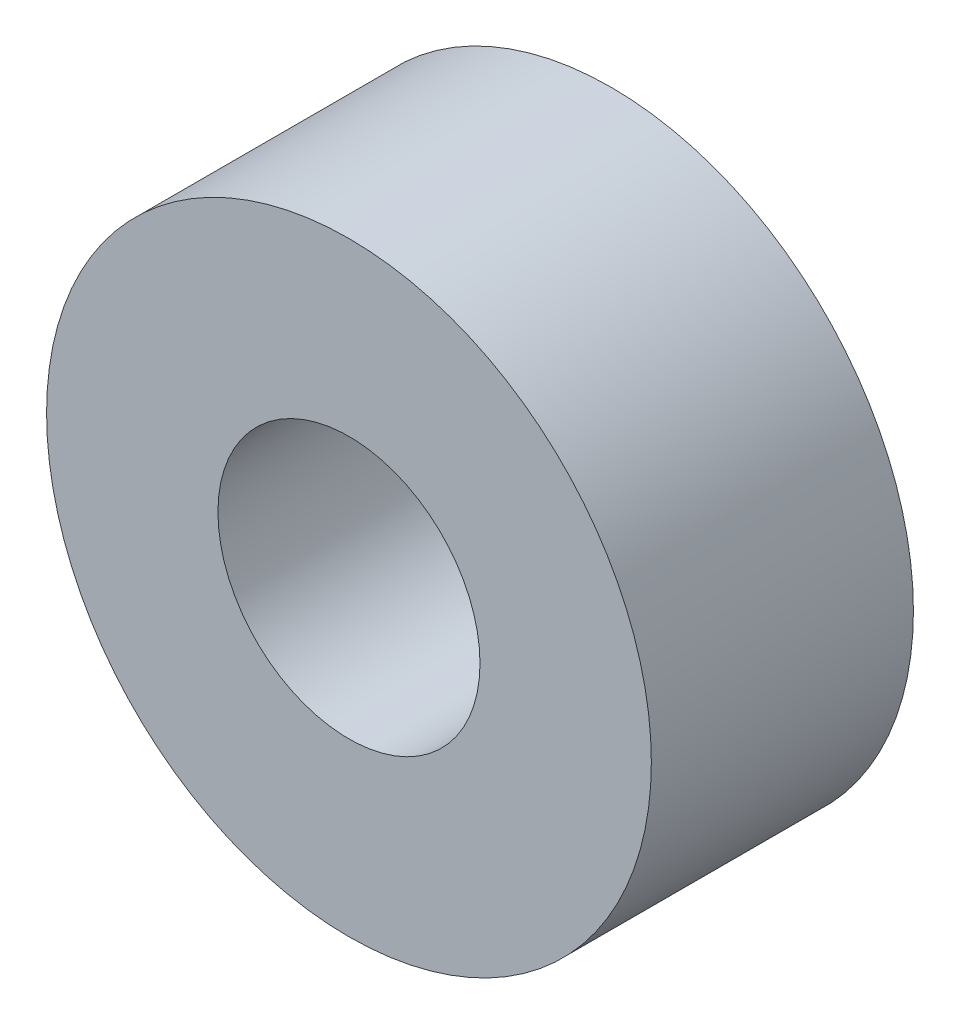
ISO-10303-21;
HEADER;
FILE_DESCRIPTION(('STEP AP214'),'2;1');
FILE_NAME('part.step','',(''),(''),'','','');
FILE_SCHEMA(('AUTOMOTIVE_DESIGN { 1 0 10303 214 1 1 1 1 }'));
ENDSEC;
DATA;
#1=APPLICATION_CONTEXT('core data for automotive mechanical design processes');
#2=APPLICATION_PROTOCOL_DEFINITION('international standard','automotive_design',2000,#1);
#3=PRODUCT_CONTEXT('',#1,'mechanical');
#4=PRODUCT('Part','Part','',(#3));
#5=PRODUCT_RELATED_PRODUCT_CATEGORY('part','',(#4));
#6=PRODUCT_DEFINITION_FORMATION('','',#4);
#7=PRODUCT_DEFINITION_CONTEXT('part definition',#1,'design');
#8=PRODUCT_DEFINITION('design','',#6,#7);
#9=PRODUCT_DEFINITION_SHAPE('','',#8);
#10=(LENGTH_UNIT() NAMED_UNIT(*) SI_UNIT(.MILLI.,.METRE.));
#11=(NAMED_UNIT(*) PLANE_ANGLE_UNIT() SI_UNIT($,.RADIAN.));
#12=(NAMED_UNIT(*) SI_UNIT($,.STERADIAN.) SOLID_ANGLE_UNIT());
#13=UNCERTAINTY_MEASURE_WITH_UNIT(LENGTH_MEASURE(1.E-05),#10,'distance_accuracy_value','');
#14=(GEOMETRIC_REPRESENTATION_CONTEXT(3) GLOBAL_UNCERTAINTY_ASSIGNED_CONTEXT((#13)) GLOBAL_UNIT_ASSIGNED_CONTEXT((#10,
#11,#12)) REPRESENTATION_CONTEXT('',''));
#15=CARTESIAN_POINT('',(0.,0.,0.));
#16=DIRECTION('',(0.,0.,1.));
#17=DIRECTION('',(1.,0.,0.));
#18=AXIS2_PLACEMENT_3D('',#15,#16,#17);
#19=CARTESIAN_POINT('',(0.,0.,6.5));
#20=DIRECTION('',(0.,0.,-1.));
#21=DIRECTION('',(-1.,0.,0.));
#22=AXIS2_PLACEMENT_3D('',#19,#20,#21);
#23=CYLINDRICAL_SURFACE('',#22,7.5);
#24=CARTESIAN_POINT('',(0.,0.,6.5));
#25=DIRECTION('',(0.,0.,1.));
#26=DIRECTION('',(1.,0.,0.));
#27=AXIS2_PLACEMENT_3D('',#24,#25,#26);
#28=CIRCLE('',#27,7.5);
#29=CARTESIAN_POINT('',(7.5,0.,6.5));
#30=VERTEX_POINT('',#29);
#31=EDGE_CURVE('E10',#30,#30,#28,.T.);
#32=ORIENTED_EDGE('',*,*,#31,.F.);
#33=EDGE_LOOP('',(#32));
#34=FACE_BOUND('',#33,.T.);
#35=CARTESIAN_POINT('',(0.,0.,0.));
#36=DIRECTION('',(0.,0.,1.));
#37=DIRECTION('',(1.,0.,0.));
#38=AXIS2_PLACEMENT_3D('',#35,#36,#37);
#39=CIRCLE('',#38,7.5);
#40=CARTESIAN_POINT('',(7.5,0.,0.));
#41=VERTEX_POINT('',#40);
#42=EDGE_CURVE('E40',#41,#41,#39,.T.);
#43=ORIENTED_EDGE('',*,*,#42,.T.);
#44=EDGE_LOOP('',(#43));
#45=FACE_BOUND('',#44,.T.);
#46=ADVANCED_FACE('F37',(#34,#45),#23,.T.);
#47=CARTESIAN_POINT('',(0.,0.,6.5));
#48=DIRECTION('',(0.,0.,1.));
#49=DIRECTION('',(1.,0.,0.));
#50=AXIS2_PLACEMENT_3D('',#47,#48,#49);
#51=PLANE('',#50);
#52=CARTESIAN_POINT('',(0.,0.,6.5));
#53=DIRECTION('',(0.,0.,1.));
#54=DIRECTION('',(1.,0.,0.));
#55=AXIS2_PLACEMENT_3D('',#52,#53,#54);
#56=CIRCLE('',#55,3.25);
#57=CARTESIAN_POINT('',(3.25,0.,6.5));
#58=VERTEX_POINT('',#57);
#59=EDGE_CURVE('E49',#58,#58,#56,.T.);
#60=ORIENTED_EDGE('',*,*,#59,.F.);
#61=EDGE_LOOP('',(#60));
#62=FACE_BOUND('',#61,.T.);
#63=ORIENTED_EDGE('',*,*,#31,.T.);
#64=EDGE_LOOP('',(#63));
#65=FACE_BOUND('',#64,.T.);
#66=ADVANCED_FACE('F64',(#62,#65),#51,.T.);
#67=CARTESIAN_POINT('',(0.,0.,0.));
#68=DIRECTION('',(0.,0.,1.));
#69=DIRECTION('',(1.,0.,0.));
#70=AXIS2_PLACEMENT_3D('',#67,#68,#69);
#71=PLANE('',#70);
#72=CARTESIAN_POINT('',(0.,0.,0.));
#73=DIRECTION('',(0.,0.,-1.));
#74=DIRECTION('',(-1.,0.,0.));
#75=AXIS2_PLACEMENT_3D('',#72,#73,#74);
#76=CIRCLE('',#75,3.25);
#77=CARTESIAN_POINT('',(-3.25,0.,0.));
#78=VERTEX_POINT('',#77);
#79=EDGE_CURVE('E54',#78,#78,#76,.T.);
#80=ORIENTED_EDGE('',*,*,#79,.F.);
#81=EDGE_LOOP('',(#80));
#82=FACE_BOUND('',#81,.T.);
#83=ORIENTED_EDGE('',*,*,#42,.F.);
#84=EDGE_LOOP('',(#83));
#85=FACE_BOUND('',#84,.T.);
#86=ADVANCED_FACE('F61',(#82,#85),#71,.F.);
#87=CARTESIAN_POINT('',(0.,0.,10.));
#88=DIRECTION('',(0.,0.,-1.));
#89=DIRECTION('',(-1.,0.,0.));
#90=AXIS2_PLACEMENT_3D('',#87,#88,#89);
#91=CYLINDRICAL_SURFACE('',#90,3.25);
#92=ORIENTED_EDGE('',*,*,#59,.T.);
#93=EDGE_LOOP('',(#92));
#94=FACE_BOUND('',#93,.T.);
#95=ORIENTED_EDGE('',*,*,#79,.T.);
#96=EDGE_LOOP('',(#95));
#97=FACE_BOUND('',#96,.T.);
#98=ADVANCED_FACE('F59',(#94,#97),#91,.F.);
#99=CLOSED_SHELL('',(#46,#66,#86,#98));
#100=MANIFOLD_SOLID_BREP('B2',#99);
#101=ADVANCED_BREP_SHAPE_REPRESENTATION('',(#18,#100),#14);
#102=SHAPE_DEFINITION_REPRESENTATION(#9,#101);
ENDSEC;
END-ISO-10303-21;
